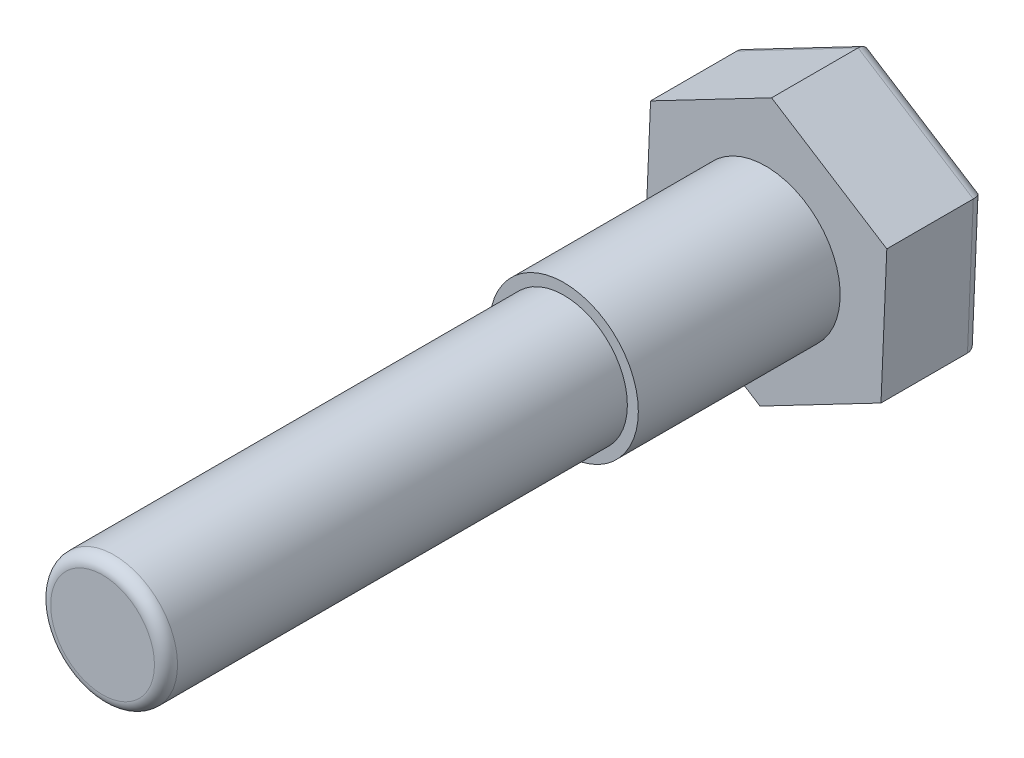
ISO-10303-21;
HEADER;
FILE_DESCRIPTION(('STEP AP214'),'2;1');
FILE_NAME('part.step','',(''),(''),'','','');
FILE_SCHEMA(('AUTOMOTIVE_DESIGN { 1 0 10303 214 1 1 1 1 }'));
ENDSEC;
DATA;
#1=APPLICATION_CONTEXT('core data for automotive mechanical design processes');
#2=APPLICATION_PROTOCOL_DEFINITION('international standard','automotive_design',2000,#1);
#3=PRODUCT_CONTEXT('',#1,'mechanical');
#4=PRODUCT('Part','Part','',(#3));
#5=PRODUCT_RELATED_PRODUCT_CATEGORY('part','',(#4));
#6=PRODUCT_DEFINITION_FORMATION('','',#4);
#7=PRODUCT_DEFINITION_CONTEXT('part definition',#1,'design');
#8=PRODUCT_DEFINITION('design','',#6,#7);
#9=PRODUCT_DEFINITION_SHAPE('','',#8);
#10=(LENGTH_UNIT() NAMED_UNIT(*) SI_UNIT(.MILLI.,.METRE.));
#11=(NAMED_UNIT(*) PLANE_ANGLE_UNIT() SI_UNIT($,.RADIAN.));
#12=(NAMED_UNIT(*) SI_UNIT($,.STERADIAN.) SOLID_ANGLE_UNIT());
#13=UNCERTAINTY_MEASURE_WITH_UNIT(LENGTH_MEASURE(1.E-05),#10,'distance_accuracy_value','');
#14=(GEOMETRIC_REPRESENTATION_CONTEXT(3) GLOBAL_UNCERTAINTY_ASSIGNED_CONTEXT((#13)) GLOBAL_UNIT_ASSIGNED_CONTEXT((#10,
#11,#12)) REPRESENTATION_CONTEXT('',''));
#15=CARTESIAN_POINT('',(0.,0.,0.));
#16=DIRECTION('',(0.,0.,1.));
#17=DIRECTION('',(1.,0.,0.));
#18=AXIS2_PLACEMENT_3D('',#15,#16,#17);
#19=CARTESIAN_POINT('',(0.,0.,52.));
#20=DIRECTION('',(0.,0.,1.));
#21=DIRECTION('',(1.,0.,0.));
#22=AXIS2_PLACEMENT_3D('',#19,#20,#21);
#23=PLANE('',#22);
#24=CARTESIAN_POINT('',(0.,0.,52.));
#25=DIRECTION('',(0.,0.,1.));
#26=DIRECTION('',(1.,0.,0.));
#27=AXIS2_PLACEMENT_3D('',#24,#25,#26);
#28=CIRCLE('',#27,12.9);
#29=CARTESIAN_POINT('',(12.9,0.,52.));
#30=VERTEX_POINT('',#29);
#31=EDGE_CURVE('E131',#30,#30,#28,.T.);
#32=ORIENTED_EDGE('',*,*,#31,.T.);
#33=EDGE_LOOP('',(#32));
#34=FACE_BOUND('',#33,.T.);
#35=CARTESIAN_POINT('',(0.,0.,52.));
#36=DIRECTION('',(0.,0.,1.));
#37=DIRECTION('',(1.,0.,0.));
#38=AXIS2_PLACEMENT_3D('',#35,#36,#37);
#39=CIRCLE('',#38,11.);
#40=CARTESIAN_POINT('',(11.,0.,52.));
#41=VERTEX_POINT('',#40);
#42=EDGE_CURVE('E169',#41,#41,#39,.T.);
#43=ORIENTED_EDGE('',*,*,#42,.F.);
#44=EDGE_LOOP('',(#43));
#45=FACE_BOUND('',#44,.T.);
#46=ADVANCED_FACE('F37',(#34,#45),#23,.T.);
#47=CARTESIAN_POINT('',(18.9733976863162,-36.3457037383633,17.));
#48=DIRECTION('',(0.,0.,-1.));
#49=DIRECTION('',(-1.,0.,0.));
#50=AXIS2_PLACEMENT_3D('',#47,#48,#49);
#51=PLANE('',#50);
#52=DIRECTION('',(0.0424733530909036,0.999097599975706,0.));
#53=VECTOR('',#52,1.);
#54=CARTESIAN_POINT('',(19.9787997617734,-12.6957037383635,17.));
#55=LINE('',#54,#53);
#56=CARTESIAN_POINT('',(19.9787997617734,-12.6957037383635,17.));
#57=VERTEX_POINT('',#56);
#58=CARTESIAN_POINT('',(20.9842018372306,10.9542962616365,17.));
#59=VERTEX_POINT('',#58);
#60=EDGE_CURVE('E123',#57,#59,#55,.T.);
#61=ORIENTED_EDGE('',*,*,#60,.T.);
#62=DIRECTION('',(-0.844007225893572,0.536331802748482,0.));
#63=VECTOR('',#62,1.);
#64=CARTESIAN_POINT('',(20.9842018372306,10.9542962616365,17.));
#65=LINE('',#64,#63);
#66=CARTESIAN_POINT('',(1.0054020754572,23.65,17.));
#67=VERTEX_POINT('',#66);
#68=EDGE_CURVE('E111',#59,#67,#65,.T.);
#69=ORIENTED_EDGE('',*,*,#68,.T.);
#70=DIRECTION('',(-0.886480578984472,-0.462765797227231,0.));
#71=VECTOR('',#70,1.);
#72=CARTESIAN_POINT('',(1.0054020754572,23.65,17.));
#73=LINE('',#72,#71);
#74=CARTESIAN_POINT('',(-19.9787997617736,12.6957037383632,17.));
#75=VERTEX_POINT('',#74);
#76=EDGE_CURVE('E122',#67,#75,#73,.T.);
#77=ORIENTED_EDGE('',*,*,#76,.T.);
#78=DIRECTION('',(-0.0424733530908878,-0.999097599975706,0.));
#79=VECTOR('',#78,1.);
#80=CARTESIAN_POINT('',(-19.9787997617736,12.6957037383632,17.));
#81=LINE('',#80,#79);
#82=CARTESIAN_POINT('',(-20.9842018372304,-10.9542962616368,17.));
#83=VERTEX_POINT('',#82);
#84=EDGE_CURVE('E273',#75,#83,#81,.T.);
#85=ORIENTED_EDGE('',*,*,#84,.T.);
#86=DIRECTION('',(0.844007225893576,-0.536331802748476,0.));
#87=VECTOR('',#86,1.);
#88=CARTESIAN_POINT('',(-20.9842018372304,-10.9542962616368,17.));
#89=LINE('',#88,#87);
#90=CARTESIAN_POINT('',(-1.00540207545719,-23.65,17.));
#91=VERTEX_POINT('',#90);
#92=EDGE_CURVE('E275',#83,#91,#89,.T.);
#93=ORIENTED_EDGE('',*,*,#92,.T.);
#94=DIRECTION('',(0.886480578984476,0.462765797227224,0.));
#95=VECTOR('',#94,1.);
#96=CARTESIAN_POINT('',(-1.00540207545719,-23.65,17.));
#97=LINE('',#96,#95);
#98=EDGE_CURVE('E129',#91,#57,#97,.T.);
#99=ORIENTED_EDGE('',*,*,#98,.T.);
#100=EDGE_LOOP('',(#61,#69,#77,#85,#93,#99));
#101=FACE_BOUND('',#100,.T.);
#102=CARTESIAN_POINT('',(0.,0.,17.));
#103=DIRECTION('',(0.,0.,-1.));
#104=DIRECTION('',(-1.,0.,0.));
#105=AXIS2_PLACEMENT_3D('',#102,#103,#104);
#106=CIRCLE('',#105,12.9);
#107=CARTESIAN_POINT('',(-12.9,0.,17.));
#108=VERTEX_POINT('',#107);
#109=EDGE_CURVE('E136',#108,#108,#106,.F.);
#110=ORIENTED_EDGE('',*,*,#109,.F.);
#111=EDGE_LOOP('',(#110));
#112=FACE_BOUND('',#111,.T.);
#113=ADVANCED_FACE('F126',(#101,#112),#51,.F.);
#114=CARTESIAN_POINT('',(19.9787997617734,-12.6957037383635,17.));
#115=DIRECTION('',(-0.999097599975706,0.0424733530909036,0.));
#116=DIRECTION('',(-0.0424733530909036,-0.999097599975706,0.));
#117=AXIS2_PLACEMENT_3D('',#114,#115,#116);
#118=PLANE('',#117);
#119=DIRECTION('',(0.,0.,-1.));
#120=VECTOR('',#119,1.);
#121=CARTESIAN_POINT('',(19.9787997617734,-12.6957037383635,17.));
#122=LINE('',#121,#120);
#123=CARTESIAN_POINT('',(19.9787997617734,-12.6957037383635,2.));
#124=VERTEX_POINT('',#123);
#125=EDGE_CURVE('E280',#57,#124,#122,.T.);
#126=ORIENTED_EDGE('',*,*,#125,.T.);
#127=DIRECTION('',(0.0424733530909036,0.999097599975706,0.));
#128=VECTOR('',#127,1.);
#129=CARTESIAN_POINT('',(20.9842018372306,10.9542962616365,2.));
#130=LINE('',#129,#128);
#131=CARTESIAN_POINT('',(20.9842018372306,10.9542962616365,2.));
#132=VERTEX_POINT('',#131);
#133=EDGE_CURVE('E135',#124,#132,#130,.T.);
#134=ORIENTED_EDGE('',*,*,#133,.T.);
#135=DIRECTION('',(0.,0.,-1.));
#136=VECTOR('',#135,1.);
#137=CARTESIAN_POINT('',(20.9842018372306,10.9542962616365,17.));
#138=LINE('',#137,#136);
#139=EDGE_CURVE('E116',#59,#132,#138,.T.);
#140=ORIENTED_EDGE('',*,*,#139,.F.);
#141=ORIENTED_EDGE('',*,*,#60,.F.);
#142=EDGE_LOOP('',(#126,#134,#140,#141));
#143=FACE_BOUND('',#142,.T.);
#144=ADVANCED_FACE('F133',(#143),#118,.F.);
#145=CARTESIAN_POINT('',(20.9842018372306,10.9542962616365,17.));
#146=DIRECTION('',(-0.536331802748482,-0.844007225893572,0.));
#147=DIRECTION('',(0.844007225893572,-0.536331802748482,0.));
#148=AXIS2_PLACEMENT_3D('',#145,#146,#147);
#149=PLANE('',#148);
#150=ORIENTED_EDGE('',*,*,#139,.T.);
#151=DIRECTION('',(-0.844007225893572,0.536331802748482,0.));
#152=VECTOR('',#151,1.);
#153=CARTESIAN_POINT('',(1.00540207545719,23.65,2.));
#154=LINE('',#153,#152);
#155=CARTESIAN_POINT('',(1.0054020754572,23.65,2.));
#156=VERTEX_POINT('',#155);
#157=EDGE_CURVE('E139',#132,#156,#154,.T.);
#158=ORIENTED_EDGE('',*,*,#157,.T.);
#159=DIRECTION('',(0.,0.,-1.));
#160=VECTOR('',#159,1.);
#161=CARTESIAN_POINT('',(1.0054020754572,23.65,17.));
#162=LINE('',#161,#160);
#163=EDGE_CURVE('E119',#67,#156,#162,.T.);
#164=ORIENTED_EDGE('',*,*,#163,.F.);
#165=ORIENTED_EDGE('',*,*,#68,.F.);
#166=EDGE_LOOP('',(#150,#158,#164,#165));
#167=FACE_BOUND('',#166,.T.);
#168=ADVANCED_FACE('F113',(#167),#149,.F.);
#169=CARTESIAN_POINT('',(1.0054020754572,23.65,17.));
#170=DIRECTION('',(0.462765797227231,-0.886480578984472,0.));
#171=DIRECTION('',(0.886480578984472,0.462765797227231,0.));
#172=AXIS2_PLACEMENT_3D('',#169,#170,#171);
#173=PLANE('',#172);
#174=ORIENTED_EDGE('',*,*,#163,.T.);
#175=DIRECTION('',(-0.886480578984472,-0.462765797227231,0.));
#176=VECTOR('',#175,1.);
#177=CARTESIAN_POINT('',(-19.9787997617736,12.6957037383632,2.));
#178=LINE('',#177,#176);
#179=CARTESIAN_POINT('',(-19.9787997617736,12.6957037383632,2.));
#180=VERTEX_POINT('',#179);
#181=EDGE_CURVE('E159',#156,#180,#178,.T.);
#182=ORIENTED_EDGE('',*,*,#181,.T.);
#183=DIRECTION('',(0.,0.,-1.));
#184=VECTOR('',#183,1.);
#185=CARTESIAN_POINT('',(-19.9787997617736,12.6957037383632,17.));
#186=LINE('',#185,#184);
#187=EDGE_CURVE('E141',#75,#180,#186,.T.);
#188=ORIENTED_EDGE('',*,*,#187,.F.);
#189=ORIENTED_EDGE('',*,*,#76,.F.);
#190=EDGE_LOOP('',(#174,#182,#188,#189));
#191=FACE_BOUND('',#190,.T.);
#192=ADVANCED_FACE('F224',(#191),#173,.F.);
#193=CARTESIAN_POINT('',(-19.9787997617736,12.6957037383632,17.));
#194=DIRECTION('',(0.999097599975706,-0.0424733530908878,0.));
#195=DIRECTION('',(0.0424733530908878,0.999097599975707,0.));
#196=AXIS2_PLACEMENT_3D('',#193,#194,#195);
#197=PLANE('',#196);
#198=ORIENTED_EDGE('',*,*,#187,.T.);
#199=DIRECTION('',(-0.0424733530908878,-0.999097599975707,0.));
#200=VECTOR('',#199,1.);
#201=CARTESIAN_POINT('',(-20.9842018372304,-10.9542962616368,2.));
#202=LINE('',#201,#200);
#203=CARTESIAN_POINT('',(-20.9842018372304,-10.9542962616368,2.));
#204=VERTEX_POINT('',#203);
#205=EDGE_CURVE('E161',#180,#204,#202,.T.);
#206=ORIENTED_EDGE('',*,*,#205,.T.);
#207=DIRECTION('',(0.,0.,-1.));
#208=VECTOR('',#207,1.);
#209=CARTESIAN_POINT('',(-20.9842018372304,-10.9542962616368,17.));
#210=LINE('',#209,#208);
#211=EDGE_CURVE('E284',#83,#204,#210,.T.);
#212=ORIENTED_EDGE('',*,*,#211,.F.);
#213=ORIENTED_EDGE('',*,*,#84,.F.);
#214=EDGE_LOOP('',(#198,#206,#212,#213));
#215=FACE_BOUND('',#214,.T.);
#216=ADVANCED_FACE('F221',(#215),#197,.F.);
#217=CARTESIAN_POINT('',(-20.9842018372304,-10.9542962616368,17.));
#218=DIRECTION('',(0.536331802748476,0.844007225893576,0.));
#219=DIRECTION('',(-0.844007225893576,0.536331802748476,0.));
#220=AXIS2_PLACEMENT_3D('',#217,#218,#219);
#221=PLANE('',#220);
#222=ORIENTED_EDGE('',*,*,#211,.T.);
#223=DIRECTION('',(0.844007225893576,-0.536331802748476,0.));
#224=VECTOR('',#223,1.);
#225=CARTESIAN_POINT('',(-1.00540207545719,-23.65,2.));
#226=LINE('',#225,#224);
#227=CARTESIAN_POINT('',(-1.00540207545719,-23.65,2.));
#228=VERTEX_POINT('',#227);
#229=EDGE_CURVE('E60',#204,#228,#226,.T.);
#230=ORIENTED_EDGE('',*,*,#229,.T.);
#231=DIRECTION('',(0.,0.,-1.));
#232=VECTOR('',#231,1.);
#233=CARTESIAN_POINT('',(-1.00540207545719,-23.65,17.));
#234=LINE('',#233,#232);
#235=EDGE_CURVE('E282',#91,#228,#234,.T.);
#236=ORIENTED_EDGE('',*,*,#235,.F.);
#237=ORIENTED_EDGE('',*,*,#92,.F.);
#238=EDGE_LOOP('',(#222,#230,#236,#237));
#239=FACE_BOUND('',#238,.T.);
#240=ADVANCED_FACE('F218',(#239),#221,.F.);
#241=CARTESIAN_POINT('',(-1.00540207545719,-23.65,17.));
#242=DIRECTION('',(-0.462765797227224,0.886480578984476,0.));
#243=DIRECTION('',(-0.886480578984476,-0.462765797227224,0.));
#244=AXIS2_PLACEMENT_3D('',#241,#242,#243);
#245=PLANE('',#244);
#246=ORIENTED_EDGE('',*,*,#235,.T.);
#247=DIRECTION('',(0.886480578984476,0.462765797227224,0.));
#248=VECTOR('',#247,1.);
#249=CARTESIAN_POINT('',(19.9787997617734,-12.6957037383635,2.));
#250=LINE('',#249,#248);
#251=EDGE_CURVE('E52',#228,#124,#250,.T.);
#252=ORIENTED_EDGE('',*,*,#251,.T.);
#253=ORIENTED_EDGE('',*,*,#125,.F.);
#254=ORIENTED_EDGE('',*,*,#98,.F.);
#255=EDGE_LOOP('',(#246,#252,#253,#254));
#256=FACE_BOUND('',#255,.T.);
#257=ADVANCED_FACE('F214',(#256),#245,.F.);
#258=CARTESIAN_POINT('',(18.9733976863162,-36.3457037383633,0.));
#259=DIRECTION('',(0.,0.,-1.));
#260=DIRECTION('',(-1.,0.,0.));
#261=AXIS2_PLACEMENT_3D('',#258,#259,#260);
#262=PLANE('',#261);
#263=DIRECTION('',(-0.886480578984472,-0.462765797227231,0.));
#264=VECTOR('',#263,1.);
#265=CARTESIAN_POINT('',(1.93093366991166,21.8770388420311,0.));
#266=LINE('',#265,#264);
#267=CARTESIAN_POINT('',(-18.029648565503,11.4570984955961,0.));
#268=VERTEX_POINT('',#267);
#269=CARTESIAN_POINT('',(0.907314068095531,21.3426829268293,0.));
#270=VERTEX_POINT('',#269);
#271=EDGE_CURVE('E154',#268,#270,#266,.F.);
#272=ORIENTED_EDGE('',*,*,#271,.T.);
#273=DIRECTION('',(-0.844007225893572,0.536331802748482,0.));
#274=VECTOR('',#273,1.);
#275=CARTESIAN_POINT('',(19.9115382317336,9.26628180984933,0.));
#276=LINE('',#275,#274);
#277=CARTESIAN_POINT('',(18.9369626335983,9.88558443123292,0.));
#278=VERTEX_POINT('',#277);
#279=EDGE_CURVE('E156',#270,#278,#276,.F.);
#280=ORIENTED_EDGE('',*,*,#279,.T.);
#281=DIRECTION('',(0.0424733530909036,0.999097599975706,0.));
#282=VECTOR('',#281,1.);
#283=CARTESIAN_POINT('',(17.980604561822,-12.6107570321817,0.));
#284=LINE('',#283,#282);
#285=CARTESIAN_POINT('',(18.0296485655028,-11.4570984955964,0.));
#286=VERTEX_POINT('',#285);
#287=EDGE_CURVE('E146',#278,#286,#284,.F.);
#288=ORIENTED_EDGE('',*,*,#287,.T.);
#289=DIRECTION('',(0.886480578984476,0.462765797227224,0.));
#290=VECTOR('',#289,1.);
#291=CARTESIAN_POINT('',(-1.93093366991164,-21.877038842031,0.));
#292=LINE('',#291,#290);
#293=CARTESIAN_POINT('',(-0.90731406809552,-21.3426829268293,0.));
#294=VERTEX_POINT('',#293);
#295=EDGE_CURVE('E148',#286,#294,#292,.F.);
#296=ORIENTED_EDGE('',*,*,#295,.T.);
#297=DIRECTION('',(0.844007225893576,-0.536331802748476,0.));
#298=VECTOR('',#297,1.);
#299=CARTESIAN_POINT('',(-19.9115382317334,-9.26628180984964,0.));
#300=LINE('',#299,#298);
#301=CARTESIAN_POINT('',(-18.9369626335981,-9.88558443123322,0.));
#302=VERTEX_POINT('',#301);
#303=EDGE_CURVE('E150',#294,#302,#300,.F.);
#304=ORIENTED_EDGE('',*,*,#303,.T.);
#305=DIRECTION('',(-0.0424733530908878,-0.999097599975707,0.));
#306=VECTOR('',#305,1.);
#307=CARTESIAN_POINT('',(-17.9806045618221,12.6107570321814,0.));
#308=LINE('',#307,#306);
#309=EDGE_CURVE('E152',#302,#268,#308,.F.);
#310=ORIENTED_EDGE('',*,*,#309,.T.);
#311=EDGE_LOOP('',(#272,#280,#288,#296,#304,#310));
#312=FACE_BOUND('',#311,.T.);
#313=ADVANCED_FACE('F209',(#312),#262,.T.);
#314=CARTESIAN_POINT('',(0.,0.,52.));
#315=DIRECTION('',(0.,0.,-1.));
#316=DIRECTION('',(-1.,0.,0.));
#317=AXIS2_PLACEMENT_3D('',#314,#315,#316);
#318=CYLINDRICAL_SURFACE('',#317,12.9);
#319=ORIENTED_EDGE('',*,*,#31,.F.);
#320=EDGE_LOOP('',(#319));
#321=FACE_BOUND('',#320,.T.);
#322=ORIENTED_EDGE('',*,*,#109,.T.);
#323=EDGE_LOOP('',(#322));
#324=FACE_BOUND('',#323,.T.);
#325=ADVANCED_FACE('F206',(#321,#324),#318,.T.);
#326=CARTESIAN_POINT('',(-19.9115382317334,-9.26628180984964,2.));
#327=DIRECTION('',(-0.844007225893576,0.536331802748476,0.));
#328=DIRECTION('',(-0.536331802748476,-0.844007225893576,0.));
#329=AXIS2_PLACEMENT_3D('',#326,#327,#328);
#330=CYLINDRICAL_SURFACE('',#329,2.);
#331=CARTESIAN_POINT('',(-18.9369626335981,-9.88558443123322,2.));
#332=DIRECTION('',(-0.462765797227234,0.886480578984471,0.));
#333=DIRECTION('',(-0.886480578984471,-0.462765797227234,0.));
#334=AXIS2_PLACEMENT_3D('',#331,#332,#333);
#335=ELLIPSE('',#334,2.3094010767585,2.);
#336=EDGE_CURVE('E177',#302,#204,#335,.T.);
#337=ORIENTED_EDGE('',*,*,#336,.F.);
#338=ORIENTED_EDGE('',*,*,#303,.F.);
#339=CARTESIAN_POINT('',(-0.90731406809552,-21.3426829268293,2.));
#340=DIRECTION('',(-0.999097599975706,0.0424733530909003,0.));
#341=DIRECTION('',(-0.0424733530909002,-0.999097599975706,0.));
#342=AXIS2_PLACEMENT_3D('',#339,#340,#341);
#343=ELLIPSE('',#342,2.3094010767585,2.);
#344=EDGE_CURVE('E180',#228,#294,#343,.F.);
#345=ORIENTED_EDGE('',*,*,#344,.F.);
#346=ORIENTED_EDGE('',*,*,#229,.F.);
#347=EDGE_LOOP('',(#337,#338,#345,#346));
#348=FACE_BOUND('',#347,.T.);
#349=ADVANCED_FACE('F208',(#348),#330,.T.);
#350=CARTESIAN_POINT('',(-1.93093366991164,-21.877038842031,2.));
#351=DIRECTION('',(-0.886480578984476,-0.462765797227224,0.));
#352=DIRECTION('',(0.462765797227224,-0.886480578984476,0.));
#353=AXIS2_PLACEMENT_3D('',#350,#351,#352);
#354=CYLINDRICAL_SURFACE('',#353,2.);
#355=ORIENTED_EDGE('',*,*,#344,.T.);
#356=ORIENTED_EDGE('',*,*,#295,.F.);
#357=CARTESIAN_POINT('',(18.0296485655028,-11.4570984955964,2.));
#358=DIRECTION('',(-0.536331802748482,-0.844007225893572,0.));
#359=DIRECTION('',(0.844007225893572,-0.536331802748482,0.));
#360=AXIS2_PLACEMENT_3D('',#357,#358,#359);
#361=ELLIPSE('',#360,2.3094010767585,2.);
#362=EDGE_CURVE('E174',#124,#286,#361,.F.);
#363=ORIENTED_EDGE('',*,*,#362,.F.);
#364=ORIENTED_EDGE('',*,*,#251,.F.);
#365=EDGE_LOOP('',(#355,#356,#363,#364));
#366=FACE_BOUND('',#365,.T.);
#367=ADVANCED_FACE('F248',(#366),#354,.T.);
#368=CARTESIAN_POINT('',(-17.9806045618221,12.6107570321814,2.));
#369=DIRECTION('',(0.0424733530908878,0.999097599975707,0.));
#370=DIRECTION('',(-0.999097599975707,0.0424733530908878,0.));
#371=AXIS2_PLACEMENT_3D('',#368,#369,#370);
#372=CYLINDRICAL_SURFACE('',#371,2.);
#373=ORIENTED_EDGE('',*,*,#336,.T.);
#374=ORIENTED_EDGE('',*,*,#205,.F.);
#375=CARTESIAN_POINT('',(-18.029648565503,11.457098495596,2.));
#376=DIRECTION('',(0.536331802748472,0.844007225893579,0.));
#377=DIRECTION('',(-0.844007225893579,0.536331802748472,0.));
#378=AXIS2_PLACEMENT_3D('',#375,#376,#377);
#379=ELLIPSE('',#378,2.30940107675851,2.);
#380=EDGE_CURVE('E171',#268,#180,#379,.T.);
#381=ORIENTED_EDGE('',*,*,#380,.F.);
#382=ORIENTED_EDGE('',*,*,#309,.F.);
#383=EDGE_LOOP('',(#373,#374,#381,#382));
#384=FACE_BOUND('',#383,.T.);
#385=ADVANCED_FACE('F244',(#384),#372,.T.);
#386=CARTESIAN_POINT('',(17.980604561822,-12.6107570321817,2.));
#387=DIRECTION('',(-0.0424733530909036,-0.999097599975706,0.));
#388=DIRECTION('',(0.999097599975706,-0.0424733530909036,0.));
#389=AXIS2_PLACEMENT_3D('',#386,#387,#388);
#390=CYLINDRICAL_SURFACE('',#389,2.);
#391=ORIENTED_EDGE('',*,*,#362,.T.);
#392=ORIENTED_EDGE('',*,*,#287,.F.);
#393=CARTESIAN_POINT('',(18.9369626335983,9.88558443123291,2.));
#394=DIRECTION('',(0.462765797227224,-0.886480578984476,0.));
#395=DIRECTION('',(-0.886480578984476,-0.462765797227224,0.));
#396=AXIS2_PLACEMENT_3D('',#393,#394,#395);
#397=ELLIPSE('',#396,2.3094010767585,2.);
#398=EDGE_CURVE('E168',#132,#278,#397,.F.);
#399=ORIENTED_EDGE('',*,*,#398,.F.);
#400=ORIENTED_EDGE('',*,*,#133,.F.);
#401=EDGE_LOOP('',(#391,#392,#399,#400));
#402=FACE_BOUND('',#401,.T.);
#403=ADVANCED_FACE('F240',(#402),#390,.T.);
#404=CARTESIAN_POINT('',(1.93093366991166,21.8770388420311,2.));
#405=DIRECTION('',(0.886480578984472,0.462765797227231,0.));
#406=DIRECTION('',(-0.462765797227231,0.886480578984472,0.));
#407=AXIS2_PLACEMENT_3D('',#404,#405,#406);
#408=CYLINDRICAL_SURFACE('',#407,2.);
#409=ORIENTED_EDGE('',*,*,#380,.T.);
#410=ORIENTED_EDGE('',*,*,#181,.F.);
#411=CARTESIAN_POINT('',(0.907314068095525,21.3426829268293,2.));
#412=DIRECTION('',(0.999097599975706,-0.0424733530908997,0.));
#413=DIRECTION('',(0.0424733530908995,0.999097599975706,0.));
#414=AXIS2_PLACEMENT_3D('',#411,#412,#413);
#415=ELLIPSE('',#414,2.30940107675851,2.);
#416=EDGE_CURVE('E166',#270,#156,#415,.T.);
#417=ORIENTED_EDGE('',*,*,#416,.F.);
#418=ORIENTED_EDGE('',*,*,#271,.F.);
#419=EDGE_LOOP('',(#409,#410,#417,#418));
#420=FACE_BOUND('',#419,.T.);
#421=ADVANCED_FACE('F236',(#420),#408,.T.);
#422=CARTESIAN_POINT('',(19.9115382317336,9.26628180984933,2.));
#423=DIRECTION('',(0.844007225893572,-0.536331802748482,0.));
#424=DIRECTION('',(0.536331802748482,0.844007225893572,0.));
#425=AXIS2_PLACEMENT_3D('',#422,#423,#424);
#426=CYLINDRICAL_SURFACE('',#425,2.);
#427=ORIENTED_EDGE('',*,*,#398,.T.);
#428=ORIENTED_EDGE('',*,*,#279,.F.);
#429=ORIENTED_EDGE('',*,*,#416,.T.);
#430=ORIENTED_EDGE('',*,*,#157,.F.);
#431=EDGE_LOOP('',(#427,#428,#429,#430));
#432=FACE_BOUND('',#431,.T.);
#433=ADVANCED_FACE('F233',(#432),#426,.T.);
#434=CARTESIAN_POINT('',(0.,0.,132.));
#435=DIRECTION('',(0.,0.,-1.));
#436=DIRECTION('',(-1.,0.,0.));
#437=AXIS2_PLACEMENT_3D('',#434,#435,#436);
#438=CYLINDRICAL_SURFACE('',#437,11.);
#439=CARTESIAN_POINT('',(0.,0.,130.));
#440=DIRECTION('',(0.,0.,1.));
#441=DIRECTION('',(1.,0.,0.));
#442=AXIS2_PLACEMENT_3D('',#439,#440,#441);
#443=CIRCLE('',#442,11.);
#444=CARTESIAN_POINT('',(11.,0.,130.));
#445=VERTEX_POINT('',#444);
#446=EDGE_CURVE('E11',#445,#445,#443,.F.);
#447=ORIENTED_EDGE('',*,*,#446,.T.);
#448=EDGE_LOOP('',(#447));
#449=FACE_BOUND('',#448,.T.);
#450=ORIENTED_EDGE('',*,*,#42,.T.);
#451=EDGE_LOOP('',(#450));
#452=FACE_BOUND('',#451,.T.);
#453=ADVANCED_FACE('F192',(#449,#452),#438,.T.);
#454=CARTESIAN_POINT('',(0.,0.,132.));
#455=DIRECTION('',(0.,0.,1.));
#456=DIRECTION('',(1.,0.,0.));
#457=AXIS2_PLACEMENT_3D('',#454,#455,#456);
#458=PLANE('',#457);
#459=CARTESIAN_POINT('',(0.,0.,132.));
#460=DIRECTION('',(0.,0.,1.));
#461=DIRECTION('',(1.,0.,0.));
#462=AXIS2_PLACEMENT_3D('',#459,#460,#461);
#463=CIRCLE('',#462,9.);
#464=CARTESIAN_POINT('',(9.,0.,132.));
#465=VERTEX_POINT('',#464);
#466=EDGE_CURVE('E45',#465,#465,#463,.T.);
#467=ORIENTED_EDGE('',*,*,#466,.T.);
#468=EDGE_LOOP('',(#467));
#469=FACE_BOUND('',#468,.T.);
#470=ADVANCED_FACE('F185',(#469),#458,.T.);
#471=CARTESIAN_POINT('',(0.,0.,130.));
#472=DIRECTION('',(0.,0.,1.));
#473=DIRECTION('',(1.,0.,0.));
#474=AXIS2_PLACEMENT_3D('',#471,#472,#473);
#475=TOROIDAL_SURFACE('',#474,9.,2.);
#476=ORIENTED_EDGE('',*,*,#446,.F.);
#477=EDGE_LOOP('',(#476));
#478=FACE_BOUND('',#477,.T.);
#479=ORIENTED_EDGE('',*,*,#466,.F.);
#480=EDGE_LOOP('',(#479));
#481=FACE_BOUND('',#480,.T.);
#482=ADVANCED_FACE('F39',(#478,#481),#475,.T.);
#483=CLOSED_SHELL('',(#46,#113,#144,#168,#192,#216,#240,#257,#313,#325,#349,#367,#385,#403,#421,
#433,#453,#470,#482));
#484=MANIFOLD_SOLID_BREP('B2',#483);
#485=ADVANCED_BREP_SHAPE_REPRESENTATION('',(#18,#484),#14);
#486=SHAPE_DEFINITION_REPRESENTATION(#9,#485);
ENDSEC;
END-ISO-10303-21;
